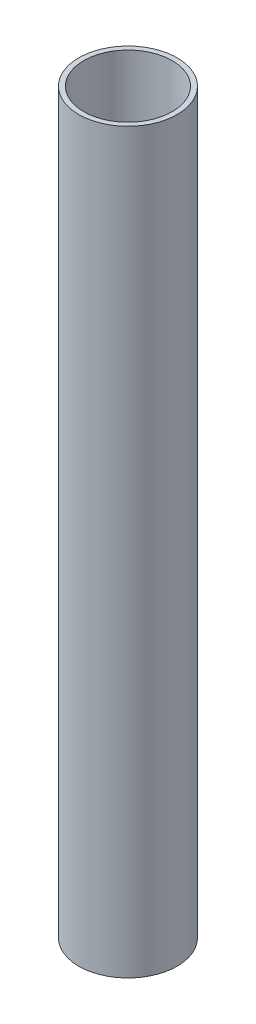
ISO-10303-21;
HEADER;
FILE_DESCRIPTION(('STEP AP214'),'2;1');
FILE_NAME('part.step','',(''),(''),'','','');
FILE_SCHEMA(('AUTOMOTIVE_DESIGN { 1 0 10303 214 1 1 1 1 }'));
ENDSEC;
DATA;
#1=APPLICATION_CONTEXT('core data for automotive mechanical design processes');
#2=APPLICATION_PROTOCOL_DEFINITION('international standard','automotive_design',2000,#1);
#3=PRODUCT_CONTEXT('',#1,'mechanical');
#4=PRODUCT('Part','Part','',(#3));
#5=PRODUCT_RELATED_PRODUCT_CATEGORY('part','',(#4));
#6=PRODUCT_DEFINITION_FORMATION('','',#4);
#7=PRODUCT_DEFINITION_CONTEXT('part definition',#1,'design');
#8=PRODUCT_DEFINITION('design','',#6,#7);
#9=PRODUCT_DEFINITION_SHAPE('','',#8);
#10=(LENGTH_UNIT() NAMED_UNIT(*) SI_UNIT(.MILLI.,.METRE.));
#11=(NAMED_UNIT(*) PLANE_ANGLE_UNIT() SI_UNIT($,.RADIAN.));
#12=(NAMED_UNIT(*) SI_UNIT($,.STERADIAN.) SOLID_ANGLE_UNIT());
#13=UNCERTAINTY_MEASURE_WITH_UNIT(LENGTH_MEASURE(1.E-05),#10,'distance_accuracy_value','');
#14=(GEOMETRIC_REPRESENTATION_CONTEXT(3) GLOBAL_UNCERTAINTY_ASSIGNED_CONTEXT((#13)) GLOBAL_UNIT_ASSIGNED_CONTEXT((#10,
#11,#12)) REPRESENTATION_CONTEXT('',''));
#15=CARTESIAN_POINT('',(0.,0.,0.));
#16=DIRECTION('',(0.,0.,1.));
#17=DIRECTION('',(1.,0.,0.));
#18=AXIS2_PLACEMENT_3D('',#15,#16,#17);
#19=CARTESIAN_POINT('',(0.,150.,0.));
#20=DIRECTION('',(0.,1.,0.));
#21=DIRECTION('',(0.,0.,1.));
#22=AXIS2_PLACEMENT_3D('',#19,#20,#21);
#23=PLANE('',#22);
#24=CARTESIAN_POINT('',(0.,150.,0.));
#25=DIRECTION('',(0.,1.,0.));
#26=DIRECTION('',(0.,0.,1.));
#27=AXIS2_PLACEMENT_3D('',#24,#25,#26);
#28=CIRCLE('',#27,10.);
#29=CARTESIAN_POINT('',(0.,150.,10.));
#30=VERTEX_POINT('',#29);
#31=EDGE_CURVE('E10',#30,#30,#28,.T.);
#32=ORIENTED_EDGE('',*,*,#31,.T.);
#33=EDGE_LOOP('',(#32));
#34=FACE_BOUND('',#33,.T.);
#35=CARTESIAN_POINT('',(0.,150.,0.));
#36=DIRECTION('',(0.,1.,0.));
#37=DIRECTION('',(0.,0.,1.));
#38=AXIS2_PLACEMENT_3D('',#35,#36,#37);
#39=CIRCLE('',#38,9.);
#40=CARTESIAN_POINT('',(0.,150.,9.));
#41=VERTEX_POINT('',#40);
#42=EDGE_CURVE('E44',#41,#41,#39,.T.);
#43=ORIENTED_EDGE('',*,*,#42,.F.);
#44=EDGE_LOOP('',(#43));
#45=FACE_BOUND('',#44,.T.);
#46=ADVANCED_FACE('F33',(#34,#45),#23,.T.);
#47=CARTESIAN_POINT('',(0.,0.,0.));
#48=DIRECTION('',(0.,1.,0.));
#49=DIRECTION('',(0.,0.,1.));
#50=AXIS2_PLACEMENT_3D('',#47,#48,#49);
#51=PLANE('',#50);
#52=CARTESIAN_POINT('',(0.,0.,0.));
#53=DIRECTION('',(0.,1.,0.));
#54=DIRECTION('',(0.,0.,1.));
#55=AXIS2_PLACEMENT_3D('',#52,#53,#54);
#56=CIRCLE('',#55,10.);
#57=CARTESIAN_POINT('',(0.,0.,10.));
#58=VERTEX_POINT('',#57);
#59=EDGE_CURVE('E37',#58,#58,#56,.T.);
#60=ORIENTED_EDGE('',*,*,#59,.F.);
#61=EDGE_LOOP('',(#60));
#62=FACE_BOUND('',#61,.T.);
#63=CARTESIAN_POINT('',(0.,0.,0.));
#64=DIRECTION('',(0.,1.,0.));
#65=DIRECTION('',(0.,0.,1.));
#66=AXIS2_PLACEMENT_3D('',#63,#64,#65);
#67=CIRCLE('',#66,9.);
#68=CARTESIAN_POINT('',(0.,0.,9.));
#69=VERTEX_POINT('',#68);
#70=EDGE_CURVE('E46',#69,#69,#67,.T.);
#71=ORIENTED_EDGE('',*,*,#70,.T.);
#72=EDGE_LOOP('',(#71));
#73=FACE_BOUND('',#72,.T.);
#74=ADVANCED_FACE('F56',(#62,#73),#51,.F.);
#75=CARTESIAN_POINT('',(0.,150.,0.));
#76=DIRECTION('',(0.,-1.,0.));
#77=DIRECTION('',(0.,0.,-1.));
#78=AXIS2_PLACEMENT_3D('',#75,#76,#77);
#79=CYLINDRICAL_SURFACE('',#78,10.);
#80=ORIENTED_EDGE('',*,*,#31,.F.);
#81=EDGE_LOOP('',(#80));
#82=FACE_BOUND('',#81,.T.);
#83=ORIENTED_EDGE('',*,*,#59,.T.);
#84=EDGE_LOOP('',(#83));
#85=FACE_BOUND('',#84,.T.);
#86=ADVANCED_FACE('F35',(#82,#85),#79,.T.);
#87=CARTESIAN_POINT('',(0.,150.,0.));
#88=DIRECTION('',(0.,-1.,0.));
#89=DIRECTION('',(0.,0.,-1.));
#90=AXIS2_PLACEMENT_3D('',#87,#88,#89);
#91=CYLINDRICAL_SURFACE('',#90,9.);
#92=ORIENTED_EDGE('',*,*,#42,.T.);
#93=EDGE_LOOP('',(#92));
#94=FACE_BOUND('',#93,.T.);
#95=ORIENTED_EDGE('',*,*,#70,.F.);
#96=EDGE_LOOP('',(#95));
#97=FACE_BOUND('',#96,.T.);
#98=ADVANCED_FACE('F52',(#94,#97),#91,.F.);
#99=CLOSED_SHELL('',(#46,#74,#86,#98));
#100=MANIFOLD_SOLID_BREP('B2',#99);
#101=ADVANCED_BREP_SHAPE_REPRESENTATION('',(#18,#100),#14);
#102=SHAPE_DEFINITION_REPRESENTATION(#9,#101);
ENDSEC;
END-ISO-10303-21;
